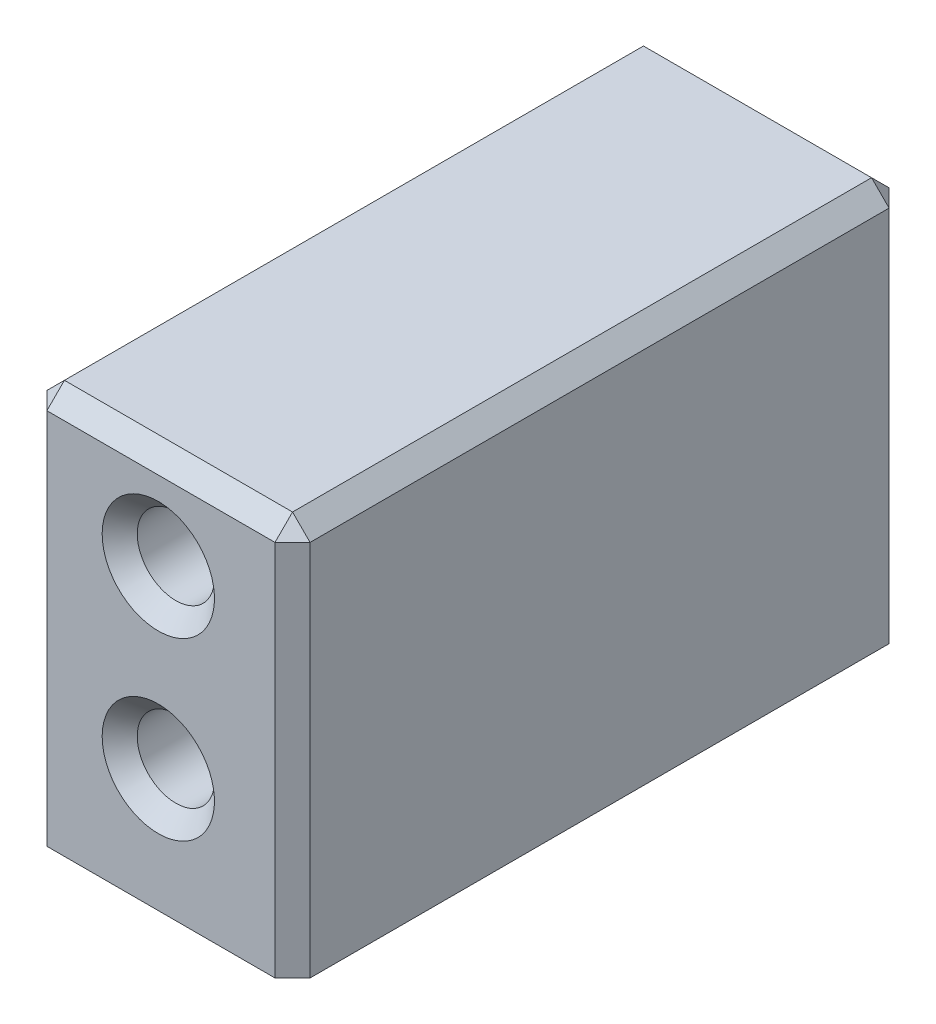
ISO-10303-21;
HEADER;
FILE_DESCRIPTION(('STEP AP214'),'2;1');
FILE_NAME('part.step','',(''),(''),'','','');
FILE_SCHEMA(('AUTOMOTIVE_DESIGN { 1 0 10303 214 1 1 1 1 }'));
ENDSEC;
DATA;
#1=APPLICATION_CONTEXT('core data for automotive mechanical design processes');
#2=APPLICATION_PROTOCOL_DEFINITION('international standard','automotive_design',2000,#1);
#3=PRODUCT_CONTEXT('',#1,'mechanical');
#4=PRODUCT('Part','Part','',(#3));
#5=PRODUCT_RELATED_PRODUCT_CATEGORY('part','',(#4));
#6=PRODUCT_DEFINITION_FORMATION('','',#4);
#7=PRODUCT_DEFINITION_CONTEXT('part definition',#1,'design');
#8=PRODUCT_DEFINITION('design','',#6,#7);
#9=PRODUCT_DEFINITION_SHAPE('','',#8);
#10=(LENGTH_UNIT() NAMED_UNIT(*) SI_UNIT(.MILLI.,.METRE.));
#11=(NAMED_UNIT(*) PLANE_ANGLE_UNIT() SI_UNIT($,.RADIAN.));
#12=(NAMED_UNIT(*) SI_UNIT($,.STERADIAN.) SOLID_ANGLE_UNIT());
#13=UNCERTAINTY_MEASURE_WITH_UNIT(LENGTH_MEASURE(1.E-05),#10,'distance_accuracy_value','');
#14=(GEOMETRIC_REPRESENTATION_CONTEXT(3) GLOBAL_UNCERTAINTY_ASSIGNED_CONTEXT((#13)) GLOBAL_UNIT_ASSIGNED_CONTEXT((#10,
#11,#12)) REPRESENTATION_CONTEXT('',''));
#15=CARTESIAN_POINT('',(0.,0.,0.));
#16=DIRECTION('',(0.,0.,1.));
#17=DIRECTION('',(1.,0.,0.));
#18=AXIS2_PLACEMENT_3D('',#15,#16,#17);
#19=CARTESIAN_POINT('',(-22.5245283018868,28.575,-21.306945754717));
#20=DIRECTION('',(0.,0.,1.));
#21=DIRECTION('',(1.,0.,0.));
#22=AXIS2_PLACEMENT_3D('',#19,#20,#21);
#23=PLANE('',#22);
#24=CARTESIAN_POINT('',(-32.2400283018868,8.89,-21.306945754717));
#25=DIRECTION('',(0.,0.,1.));
#26=DIRECTION('',(1.,0.,0.));
#27=AXIS2_PLACEMENT_3D('',#24,#25,#26);
#28=CIRCLE('',#27,4.06399999999999);
#29=CARTESIAN_POINT('',(-28.1760283018868,8.89,-21.306945754717));
#30=VERTEX_POINT('',#29);
#31=EDGE_CURVE('E276',#30,#30,#28,.T.);
#32=ORIENTED_EDGE('',*,*,#31,.T.);
#33=EDGE_LOOP('',(#32));
#34=FACE_BOUND('',#33,.T.);
#35=CARTESIAN_POINT('',(-32.2400283018868,21.59,-21.306945754717));
#36=DIRECTION('',(0.,0.,1.));
#37=DIRECTION('',(1.,0.,0.));
#38=AXIS2_PLACEMENT_3D('',#35,#36,#37);
#39=CIRCLE('',#38,4.06399999999999);
#40=CARTESIAN_POINT('',(-28.1760283018868,21.59,-21.306945754717));
#41=VERTEX_POINT('',#40);
#42=EDGE_CURVE('E272',#41,#41,#39,.T.);
#43=ORIENTED_EDGE('',*,*,#42,.T.);
#44=EDGE_LOOP('',(#43));
#45=FACE_BOUND('',#44,.T.);
#46=DIRECTION('',(-1.,0.,0.));
#47=VECTOR('',#46,1.);
#48=CARTESIAN_POINT('',(-22.5245283018868,0.,-21.306945754717));
#49=LINE('',#48,#47);
#50=CARTESIAN_POINT('',(-23.7945283018868,0.,-21.306945754717));
#51=VERTEX_POINT('',#50);
#52=CARTESIAN_POINT('',(-40.3045283018868,0.,-21.306945754717));
#53=VERTEX_POINT('',#52);
#54=EDGE_CURVE('E228',#51,#53,#49,.T.);
#55=ORIENTED_EDGE('',*,*,#54,.T.);
#56=DIRECTION('',(0.,1.,0.));
#57=VECTOR('',#56,1.);
#58=CARTESIAN_POINT('',(-40.3045283018868,28.575,-21.306945754717));
#59=LINE('',#58,#57);
#60=CARTESIAN_POINT('',(-40.3045283018868,27.305,-21.306945754717));
#61=VERTEX_POINT('',#60);
#62=EDGE_CURVE('E269',#53,#61,#59,.T.);
#63=ORIENTED_EDGE('',*,*,#62,.T.);
#64=DIRECTION('',(1.,0.,0.));
#65=VECTOR('',#64,1.);
#66=CARTESIAN_POINT('',(-22.5245283018868,27.305,-21.306945754717));
#67=LINE('',#66,#65);
#68=CARTESIAN_POINT('',(-23.7945283018868,27.305,-21.306945754717));
#69=VERTEX_POINT('',#68);
#70=EDGE_CURVE('E266',#61,#69,#67,.T.);
#71=ORIENTED_EDGE('',*,*,#70,.T.);
#72=DIRECTION('',(0.,-1.,0.));
#73=VECTOR('',#72,1.);
#74=CARTESIAN_POINT('',(-23.7945283018868,28.575,-21.306945754717));
#75=LINE('',#74,#73);
#76=EDGE_CURVE('E263',#69,#51,#75,.T.);
#77=ORIENTED_EDGE('',*,*,#76,.T.);
#78=EDGE_LOOP('',(#55,#63,#71,#77));
#79=FACE_BOUND('',#78,.T.);
#80=ADVANCED_FACE('F41',(#34,#45,#79),#23,.F.);
#81=CARTESIAN_POINT('',(-41.5745283018868,28.575,-21.306945754717));
#82=DIRECTION('',(1.,0.,0.));
#83=DIRECTION('',(0.,0.,-1.));
#84=AXIS2_PLACEMENT_3D('',#81,#82,#83);
#85=PLANE('',#84);
#86=DIRECTION('',(0.,0.,-1.));
#87=VECTOR('',#86,1.);
#88=CARTESIAN_POINT('',(-41.5745283018868,27.305,-21.306945754717));
#89=LINE('',#88,#87);
#90=CARTESIAN_POINT('',(-41.5745283018868,27.305,21.873054245283));
#91=VERTEX_POINT('',#90);
#92=CARTESIAN_POINT('',(-41.5745283018868,27.305,-20.036945754717));
#93=VERTEX_POINT('',#92);
#94=EDGE_CURVE('E155',#91,#93,#89,.T.);
#95=ORIENTED_EDGE('',*,*,#94,.T.);
#96=DIRECTION('',(0.,-1.,0.));
#97=VECTOR('',#96,1.);
#98=CARTESIAN_POINT('',(-41.5745283018868,28.575,-20.036945754717));
#99=LINE('',#98,#97);
#100=CARTESIAN_POINT('',(-41.5745283018868,0.,-20.036945754717));
#101=VERTEX_POINT('',#100);
#102=EDGE_CURVE('E148',#93,#101,#99,.T.);
#103=ORIENTED_EDGE('',*,*,#102,.T.);
#104=DIRECTION('',(0.,0.,1.));
#105=VECTOR('',#104,1.);
#106=CARTESIAN_POINT('',(-41.5745283018868,0.,-21.306945754717));
#107=LINE('',#106,#105);
#108=CARTESIAN_POINT('',(-41.5745283018868,0.,21.873054245283));
#109=VERTEX_POINT('',#108);
#110=EDGE_CURVE('E142',#101,#109,#107,.T.);
#111=ORIENTED_EDGE('',*,*,#110,.T.);
#112=DIRECTION('',(0.,1.,0.));
#113=VECTOR('',#112,1.);
#114=CARTESIAN_POINT('',(-41.5745283018868,28.575,21.873054245283));
#115=LINE('',#114,#113);
#116=EDGE_CURVE('E146',#109,#91,#115,.T.);
#117=ORIENTED_EDGE('',*,*,#116,.T.);
#118=EDGE_LOOP('',(#95,#103,#111,#117));
#119=FACE_BOUND('',#118,.T.);
#120=ADVANCED_FACE('F293',(#119),#85,.F.);
#121=CARTESIAN_POINT('',(-41.5745283018868,28.575,23.143054245283));
#122=DIRECTION('',(0.,0.,-1.));
#123=DIRECTION('',(-1.,0.,0.));
#124=AXIS2_PLACEMENT_3D('',#121,#122,#123);
#125=PLANE('',#124);
#126=CARTESIAN_POINT('',(-32.2400283018868,8.89,23.143054245283));
#127=DIRECTION('',(0.,0.,-1.));
#128=DIRECTION('',(-1.,0.,0.));
#129=AXIS2_PLACEMENT_3D('',#126,#127,#128);
#130=CIRCLE('',#129,4.06399999999999);
#131=CARTESIAN_POINT('',(-36.3040283018868,8.89,23.143054245283));
#132=VERTEX_POINT('',#131);
#133=EDGE_CURVE('E259',#132,#132,#130,.T.);
#134=ORIENTED_EDGE('',*,*,#133,.T.);
#135=EDGE_LOOP('',(#134));
#136=FACE_BOUND('',#135,.T.);
#137=CARTESIAN_POINT('',(-32.2400283018868,21.59,23.143054245283));
#138=DIRECTION('',(0.,0.,-1.));
#139=DIRECTION('',(-1.,0.,0.));
#140=AXIS2_PLACEMENT_3D('',#137,#138,#139);
#141=CIRCLE('',#140,4.06399999999999);
#142=CARTESIAN_POINT('',(-36.3040283018868,21.59,23.143054245283));
#143=VERTEX_POINT('',#142);
#144=EDGE_CURVE('E255',#143,#143,#141,.T.);
#145=ORIENTED_EDGE('',*,*,#144,.T.);
#146=EDGE_LOOP('',(#145));
#147=FACE_BOUND('',#146,.T.);
#148=DIRECTION('',(1.,0.,0.));
#149=VECTOR('',#148,1.);
#150=CARTESIAN_POINT('',(-41.5745283018868,0.,23.143054245283));
#151=LINE('',#150,#149);
#152=CARTESIAN_POINT('',(-40.3045283018868,0.,23.143054245283));
#153=VERTEX_POINT('',#152);
#154=CARTESIAN_POINT('',(-23.7945283018868,0.,23.143054245283));
#155=VERTEX_POINT('',#154);
#156=EDGE_CURVE('E121',#153,#155,#151,.T.);
#157=ORIENTED_EDGE('',*,*,#156,.T.);
#158=DIRECTION('',(0.,1.,0.));
#159=VECTOR('',#158,1.);
#160=CARTESIAN_POINT('',(-23.7945283018868,28.575,23.143054245283));
#161=LINE('',#160,#159);
#162=CARTESIAN_POINT('',(-23.7945283018868,27.305,23.143054245283));
#163=VERTEX_POINT('',#162);
#164=EDGE_CURVE('E252',#155,#163,#161,.T.);
#165=ORIENTED_EDGE('',*,*,#164,.T.);
#166=DIRECTION('',(-1.,0.,0.));
#167=VECTOR('',#166,1.);
#168=CARTESIAN_POINT('',(-41.5745283018868,27.305,23.143054245283));
#169=LINE('',#168,#167);
#170=CARTESIAN_POINT('',(-40.3045283018868,27.305,23.143054245283));
#171=VERTEX_POINT('',#170);
#172=EDGE_CURVE('E124',#163,#171,#169,.T.);
#173=ORIENTED_EDGE('',*,*,#172,.T.);
#174=DIRECTION('',(0.,-1.,0.));
#175=VECTOR('',#174,1.);
#176=CARTESIAN_POINT('',(-40.3045283018868,28.575,23.143054245283));
#177=LINE('',#176,#175);
#178=EDGE_CURVE('E118',#171,#153,#177,.T.);
#179=ORIENTED_EDGE('',*,*,#178,.T.);
#180=EDGE_LOOP('',(#157,#165,#173,#179));
#181=FACE_BOUND('',#180,.T.);
#182=ADVANCED_FACE('F120',(#136,#147,#181),#125,.F.);
#183=CARTESIAN_POINT('',(-22.5245283018868,28.575,23.143054245283));
#184=DIRECTION('',(-1.,0.,0.));
#185=DIRECTION('',(0.,0.,1.));
#186=AXIS2_PLACEMENT_3D('',#183,#184,#185);
#187=PLANE('',#186);
#188=DIRECTION('',(0.,0.,-1.));
#189=VECTOR('',#188,1.);
#190=CARTESIAN_POINT('',(-22.5245283018868,0.,23.143054245283));
#191=LINE('',#190,#189);
#192=CARTESIAN_POINT('',(-22.5245283018868,0.,21.873054245283));
#193=VERTEX_POINT('',#192);
#194=CARTESIAN_POINT('',(-22.5245283018868,0.,-20.036945754717));
#195=VERTEX_POINT('',#194);
#196=EDGE_CURVE('E141',#193,#195,#191,.T.);
#197=ORIENTED_EDGE('',*,*,#196,.T.);
#198=DIRECTION('',(0.,1.,0.));
#199=VECTOR('',#198,1.);
#200=CARTESIAN_POINT('',(-22.5245283018868,28.575,-20.036945754717));
#201=LINE('',#200,#199);
#202=CARTESIAN_POINT('',(-22.5245283018868,27.305,-20.036945754717));
#203=VERTEX_POINT('',#202);
#204=EDGE_CURVE('E11',#195,#203,#201,.T.);
#205=ORIENTED_EDGE('',*,*,#204,.T.);
#206=DIRECTION('',(0.,0.,1.));
#207=VECTOR('',#206,1.);
#208=CARTESIAN_POINT('',(-22.5245283018868,27.305,23.143054245283));
#209=LINE('',#208,#207);
#210=CARTESIAN_POINT('',(-22.5245283018868,27.305,21.873054245283));
#211=VERTEX_POINT('',#210);
#212=EDGE_CURVE('E52',#203,#211,#209,.T.);
#213=ORIENTED_EDGE('',*,*,#212,.T.);
#214=DIRECTION('',(0.,-1.,0.));
#215=VECTOR('',#214,1.);
#216=CARTESIAN_POINT('',(-22.5245283018868,28.575,21.873054245283));
#217=LINE('',#216,#215);
#218=EDGE_CURVE('E177',#211,#193,#217,.T.);
#219=ORIENTED_EDGE('',*,*,#218,.T.);
#220=EDGE_LOOP('',(#197,#205,#213,#219));
#221=FACE_BOUND('',#220,.T.);
#222=ADVANCED_FACE('F542',(#221),#187,.F.);
#223=CARTESIAN_POINT('',(0.,28.575,0.));
#224=DIRECTION('',(0.,1.,0.));
#225=DIRECTION('',(0.,0.,1.));
#226=AXIS2_PLACEMENT_3D('',#223,#224,#225);
#227=PLANE('',#226);
#228=DIRECTION('',(0.,0.,-1.));
#229=VECTOR('',#228,1.);
#230=CARTESIAN_POINT('',(-23.7945283018868,28.575,-21.306945754717));
#231=LINE('',#230,#229);
#232=CARTESIAN_POINT('',(-23.7945283018868,28.575,21.873054245283));
#233=VERTEX_POINT('',#232);
#234=CARTESIAN_POINT('',(-23.7945283018868,28.575,-20.036945754717));
#235=VERTEX_POINT('',#234);
#236=EDGE_CURVE('E167',#233,#235,#231,.T.);
#237=ORIENTED_EDGE('',*,*,#236,.T.);
#238=DIRECTION('',(-1.,0.,0.));
#239=VECTOR('',#238,1.);
#240=CARTESIAN_POINT('',(-41.5745283018868,28.575,-20.036945754717));
#241=LINE('',#240,#239);
#242=CARTESIAN_POINT('',(-40.3045283018868,28.575,-20.036945754717));
#243=VERTEX_POINT('',#242);
#244=EDGE_CURVE('E173',#235,#243,#241,.T.);
#245=ORIENTED_EDGE('',*,*,#244,.T.);
#246=DIRECTION('',(0.,0.,1.));
#247=VECTOR('',#246,1.);
#248=CARTESIAN_POINT('',(-40.3045283018868,28.575,23.143054245283));
#249=LINE('',#248,#247);
#250=CARTESIAN_POINT('',(-40.3045283018868,28.575,21.873054245283));
#251=VERTEX_POINT('',#250);
#252=EDGE_CURVE('E170',#243,#251,#249,.T.);
#253=ORIENTED_EDGE('',*,*,#252,.T.);
#254=DIRECTION('',(1.,0.,0.));
#255=VECTOR('',#254,1.);
#256=CARTESIAN_POINT('',(-22.5245283018868,28.575,21.873054245283));
#257=LINE('',#256,#255);
#258=EDGE_CURVE('E164',#251,#233,#257,.T.);
#259=ORIENTED_EDGE('',*,*,#258,.T.);
#260=EDGE_LOOP('',(#237,#245,#253,#259));
#261=FACE_BOUND('',#260,.T.);
#262=ADVANCED_FACE('F316',(#261),#227,.T.);
#263=CARTESIAN_POINT('',(0.,0.,0.));
#264=DIRECTION('',(0.,1.,0.));
#265=DIRECTION('',(0.,0.,1.));
#266=AXIS2_PLACEMENT_3D('',#263,#264,#265);
#267=PLANE('',#266);
#268=ORIENTED_EDGE('',*,*,#110,.F.);
#269=DIRECTION('',(-0.707106781186544,0.,0.707106781186551));
#270=VECTOR('',#269,1.);
#271=CARTESIAN_POINT('',(-41.5745283018868,0.,-20.036945754717));
#272=LINE('',#271,#270);
#273=EDGE_CURVE('E161',#101,#53,#272,.F.);
#274=ORIENTED_EDGE('',*,*,#273,.T.);
#275=ORIENTED_EDGE('',*,*,#54,.F.);
#276=DIRECTION('',(-0.707106781186544,0.,-0.707106781186551));
#277=VECTOR('',#276,1.);
#278=CARTESIAN_POINT('',(-23.7945283018868,0.,-21.306945754717));
#279=LINE('',#278,#277);
#280=EDGE_CURVE('E152',#51,#195,#279,.F.);
#281=ORIENTED_EDGE('',*,*,#280,.T.);
#282=ORIENTED_EDGE('',*,*,#196,.F.);
#283=DIRECTION('',(0.707106781186544,0.,-0.707106781186551));
#284=VECTOR('',#283,1.);
#285=CARTESIAN_POINT('',(-22.5245283018868,0.,21.873054245283));
#286=LINE('',#285,#284);
#287=EDGE_CURVE('E139',#193,#155,#286,.F.);
#288=ORIENTED_EDGE('',*,*,#287,.T.);
#289=ORIENTED_EDGE('',*,*,#156,.F.);
#290=DIRECTION('',(0.707106781186544,0.,0.707106781186551));
#291=VECTOR('',#290,1.);
#292=CARTESIAN_POINT('',(-40.3045283018868,0.,23.143054245283));
#293=LINE('',#292,#291);
#294=EDGE_CURVE('E135',#153,#109,#293,.F.);
#295=ORIENTED_EDGE('',*,*,#294,.T.);
#296=EDGE_LOOP('',(#268,#274,#275,#281,#282,#288,#289,#295));
#297=FACE_BOUND('',#296,.T.);
#298=ADVANCED_FACE('F134',(#297),#267,.F.);
#299=CARTESIAN_POINT('',(-32.2400283018868,8.89,-21.306945754717));
#300=DIRECTION('',(0.,0.,1.));
#301=DIRECTION('',(1.,0.,0.));
#302=AXIS2_PLACEMENT_3D('',#299,#300,#301);
#303=CYLINDRICAL_SURFACE('',#302,2.794);
#304=CARTESIAN_POINT('',(-32.2400283018868,8.89,21.873054245283));
#305=DIRECTION('',(0.,0.,-1.));
#306=DIRECTION('',(-1.,0.,0.));
#307=AXIS2_PLACEMENT_3D('',#304,#305,#306);
#308=CIRCLE('',#307,2.794);
#309=CARTESIAN_POINT('',(-35.0340283018868,8.89,21.873054245283));
#310=VERTEX_POINT('',#309);
#311=EDGE_CURVE('E130',#310,#310,#308,.F.);
#312=ORIENTED_EDGE('',*,*,#311,.T.);
#313=EDGE_LOOP('',(#312));
#314=FACE_BOUND('',#313,.T.);
#315=CARTESIAN_POINT('',(-32.2400283018868,8.89,-20.036945754717));
#316=DIRECTION('',(0.,0.,1.));
#317=DIRECTION('',(1.,0.,0.));
#318=AXIS2_PLACEMENT_3D('',#315,#316,#317);
#319=CIRCLE('',#318,2.794);
#320=CARTESIAN_POINT('',(-29.4460283018868,8.89,-20.036945754717));
#321=VERTEX_POINT('',#320);
#322=EDGE_CURVE('E243',#321,#321,#319,.F.);
#323=ORIENTED_EDGE('',*,*,#322,.T.);
#324=EDGE_LOOP('',(#323));
#325=FACE_BOUND('',#324,.T.);
#326=ADVANCED_FACE('F518',(#314,#325),#303,.F.);
#327=CARTESIAN_POINT('',(-32.2400283018868,21.59,-21.306945754717));
#328=DIRECTION('',(0.,0.,1.));
#329=DIRECTION('',(1.,0.,0.));
#330=AXIS2_PLACEMENT_3D('',#327,#328,#329);
#331=CYLINDRICAL_SURFACE('',#330,2.794);
#332=CARTESIAN_POINT('',(-32.2400283018868,21.59,21.873054245283));
#333=DIRECTION('',(0.,0.,-1.));
#334=DIRECTION('',(-1.,0.,0.));
#335=AXIS2_PLACEMENT_3D('',#332,#333,#334);
#336=CIRCLE('',#335,2.794);
#337=CARTESIAN_POINT('',(-35.0340283018868,21.59,21.873054245283));
#338=VERTEX_POINT('',#337);
#339=EDGE_CURVE('E284',#338,#338,#336,.F.);
#340=ORIENTED_EDGE('',*,*,#339,.T.);
#341=EDGE_LOOP('',(#340));
#342=FACE_BOUND('',#341,.T.);
#343=CARTESIAN_POINT('',(-32.2400283018868,21.59,-20.036945754717));
#344=DIRECTION('',(0.,0.,1.));
#345=DIRECTION('',(1.,0.,0.));
#346=AXIS2_PLACEMENT_3D('',#343,#344,#345);
#347=CIRCLE('',#346,2.794);
#348=CARTESIAN_POINT('',(-29.4460283018868,21.59,-20.036945754717));
#349=VERTEX_POINT('',#348);
#350=EDGE_CURVE('E280',#349,#349,#347,.F.);
#351=ORIENTED_EDGE('',*,*,#350,.T.);
#352=EDGE_LOOP('',(#351));
#353=FACE_BOUND('',#352,.T.);
#354=ADVANCED_FACE('F348',(#342,#353),#331,.F.);
#355=CARTESIAN_POINT('',(-32.2400283018868,8.89,21.873054245283));
#356=DIRECTION('',(0.,0.,1.));
#357=DIRECTION('',(1.,0.,0.));
#358=AXIS2_PLACEMENT_3D('',#355,#356,#357);
#359=CONICAL_SURFACE('',#358,2.794,0.78539816339745);
#360=ORIENTED_EDGE('',*,*,#133,.F.);
#361=EDGE_LOOP('',(#360));
#362=FACE_BOUND('',#361,.T.);
#363=ORIENTED_EDGE('',*,*,#311,.F.);
#364=EDGE_LOOP('',(#363));
#365=FACE_BOUND('',#364,.T.);
#366=ADVANCED_FACE('F341',(#362,#365),#359,.F.);
#367=CARTESIAN_POINT('',(-32.2400283018868,8.89,-21.306945754717));
#368=DIRECTION('',(0.,0.,-1.));
#369=DIRECTION('',(-1.,0.,0.));
#370=AXIS2_PLACEMENT_3D('',#367,#368,#369);
#371=CONICAL_SURFACE('',#370,4.06399999999999,0.785398163397443);
#372=ORIENTED_EDGE('',*,*,#322,.F.);
#373=EDGE_LOOP('',(#372));
#374=FACE_BOUND('',#373,.T.);
#375=ORIENTED_EDGE('',*,*,#31,.F.);
#376=EDGE_LOOP('',(#375));
#377=FACE_BOUND('',#376,.T.);
#378=ADVANCED_FACE('F347',(#374,#377),#371,.F.);
#379=CARTESIAN_POINT('',(-32.2400283018868,21.59,21.873054245283));
#380=DIRECTION('',(0.,0.,1.));
#381=DIRECTION('',(1.,0.,0.));
#382=AXIS2_PLACEMENT_3D('',#379,#380,#381);
#383=CONICAL_SURFACE('',#382,2.794,0.78539816339745);
#384=ORIENTED_EDGE('',*,*,#144,.F.);
#385=EDGE_LOOP('',(#384));
#386=FACE_BOUND('',#385,.T.);
#387=ORIENTED_EDGE('',*,*,#339,.F.);
#388=EDGE_LOOP('',(#387));
#389=FACE_BOUND('',#388,.T.);
#390=ADVANCED_FACE('F355',(#386,#389),#383,.F.);
#391=CARTESIAN_POINT('',(-32.2400283018868,21.59,-21.306945754717));
#392=DIRECTION('',(0.,0.,-1.));
#393=DIRECTION('',(-1.,0.,0.));
#394=AXIS2_PLACEMENT_3D('',#391,#392,#393);
#395=CONICAL_SURFACE('',#394,4.06399999999999,0.785398163397443);
#396=ORIENTED_EDGE('',*,*,#350,.F.);
#397=EDGE_LOOP('',(#396));
#398=FACE_BOUND('',#397,.T.);
#399=ORIENTED_EDGE('',*,*,#42,.F.);
#400=EDGE_LOOP('',(#399));
#401=FACE_BOUND('',#400,.T.);
#402=ADVANCED_FACE('F327',(#398,#401),#395,.F.);
#403=CARTESIAN_POINT('',(-22.5245283018868,28.575,21.873054245283));
#404=DIRECTION('',(-0.707106781186551,0.,-0.707106781186544));
#405=DIRECTION('',(0.,-1.,0.));
#406=AXIS2_PLACEMENT_3D('',#403,#404,#405);
#407=PLANE('',#406);
#408=DIRECTION('',(-0.707106781186544,0.,0.707106781186551));
#409=VECTOR('',#408,1.);
#410=CARTESIAN_POINT('',(-22.5245283018868,27.305,21.873054245283));
#411=LINE('',#410,#409);
#412=EDGE_CURVE('E46',#163,#211,#411,.F.);
#413=ORIENTED_EDGE('',*,*,#412,.F.);
#414=ORIENTED_EDGE('',*,*,#164,.F.);
#415=ORIENTED_EDGE('',*,*,#287,.F.);
#416=ORIENTED_EDGE('',*,*,#218,.F.);
#417=EDGE_LOOP('',(#413,#414,#415,#416));
#418=FACE_BOUND('',#417,.T.);
#419=ADVANCED_FACE('F44',(#418),#407,.F.);
#420=CARTESIAN_POINT('',(-22.5245283018868,27.305,21.873054245283));
#421=DIRECTION('',(0.577350269189632,0.577350269189626,0.577350269189619));
#422=DIRECTION('',(-0.707106781186544,0.707106781186551,0.));
#423=AXIS2_PLACEMENT_3D('',#420,#421,#422);
#424=PLANE('',#423);
#425=DIRECTION('',(0.,-0.707106781186544,0.707106781186551));
#426=VECTOR('',#425,1.);
#427=CARTESIAN_POINT('',(-23.7945283018868,27.94,22.508054245283));
#428=LINE('',#427,#426);
#429=EDGE_CURVE('E217',#163,#233,#428,.F.);
#430=ORIENTED_EDGE('',*,*,#429,.F.);
#431=ORIENTED_EDGE('',*,*,#412,.T.);
#432=DIRECTION('',(-0.707106781186544,0.707106781186551,0.));
#433=VECTOR('',#432,1.);
#434=CARTESIAN_POINT('',(-22.5245283018868,27.305,21.873054245283));
#435=LINE('',#434,#433);
#436=EDGE_CURVE('E220',#233,#211,#435,.F.);
#437=ORIENTED_EDGE('',*,*,#436,.F.);
#438=EDGE_LOOP('',(#430,#431,#437));
#439=FACE_BOUND('',#438,.T.);
#440=ADVANCED_FACE('F320',(#439),#424,.T.);
#441=CARTESIAN_POINT('',(-23.7945283018868,28.575,-21.306945754717));
#442=DIRECTION('',(-0.707106781186551,0.,0.707106781186544));
#443=DIRECTION('',(0.,-1.,0.));
#444=AXIS2_PLACEMENT_3D('',#441,#442,#443);
#445=PLANE('',#444);
#446=ORIENTED_EDGE('',*,*,#280,.F.);
#447=ORIENTED_EDGE('',*,*,#76,.F.);
#448=DIRECTION('',(0.707106781186544,0.,0.707106781186551));
#449=VECTOR('',#448,1.);
#450=CARTESIAN_POINT('',(-23.7945283018868,27.305,-21.306945754717));
#451=LINE('',#450,#449);
#452=EDGE_CURVE('E213',#203,#69,#451,.F.);
#453=ORIENTED_EDGE('',*,*,#452,.F.);
#454=ORIENTED_EDGE('',*,*,#204,.F.);
#455=EDGE_LOOP('',(#446,#447,#453,#454));
#456=FACE_BOUND('',#455,.T.);
#457=ADVANCED_FACE('F307',(#456),#445,.F.);
#458=CARTESIAN_POINT('',(-23.7945283018868,28.575,0.));
#459=DIRECTION('',(0.707106781186551,0.707106781186544,0.));
#460=DIRECTION('',(0.,0.,1.));
#461=AXIS2_PLACEMENT_3D('',#458,#459,#460);
#462=PLANE('',#461);
#463=ORIENTED_EDGE('',*,*,#436,.T.);
#464=ORIENTED_EDGE('',*,*,#212,.F.);
#465=DIRECTION('',(0.707106781186544,-0.707106781186552,0.));
#466=VECTOR('',#465,1.);
#467=CARTESIAN_POINT('',(-23.1595283018868,27.94,-20.036945754717));
#468=LINE('',#467,#466);
#469=EDGE_CURVE('E209',#235,#203,#468,.T.);
#470=ORIENTED_EDGE('',*,*,#469,.F.);
#471=ORIENTED_EDGE('',*,*,#236,.F.);
#472=EDGE_LOOP('',(#463,#464,#470,#471));
#473=FACE_BOUND('',#472,.T.);
#474=ADVANCED_FACE('F314',(#473),#462,.T.);
#475=CARTESIAN_POINT('',(0.,28.575,21.873054245283));
#476=DIRECTION('',(0.,0.707106781186551,0.707106781186544));
#477=DIRECTION('',(-1.,0.,0.));
#478=AXIS2_PLACEMENT_3D('',#475,#476,#477);
#479=PLANE('',#478);
#480=ORIENTED_EDGE('',*,*,#429,.T.);
#481=ORIENTED_EDGE('',*,*,#258,.F.);
#482=DIRECTION('',(0.,0.707106781186544,-0.707106781186551));
#483=VECTOR('',#482,1.);
#484=CARTESIAN_POINT('',(-40.3045283018868,28.575,21.873054245283));
#485=LINE('',#484,#483);
#486=EDGE_CURVE('E205',#171,#251,#485,.T.);
#487=ORIENTED_EDGE('',*,*,#486,.F.);
#488=ORIENTED_EDGE('',*,*,#172,.F.);
#489=EDGE_LOOP('',(#480,#481,#487,#488));
#490=FACE_BOUND('',#489,.T.);
#491=ADVANCED_FACE('F319',(#490),#479,.T.);
#492=CARTESIAN_POINT('',(-40.3045283018868,28.575,23.143054245283));
#493=DIRECTION('',(0.707106781186551,0.,-0.707106781186544));
#494=DIRECTION('',(0.,-1.,0.));
#495=AXIS2_PLACEMENT_3D('',#492,#493,#494);
#496=PLANE('',#495);
#497=ORIENTED_EDGE('',*,*,#294,.F.);
#498=ORIENTED_EDGE('',*,*,#178,.F.);
#499=DIRECTION('',(-0.707106781186544,0.,-0.707106781186551));
#500=VECTOR('',#499,1.);
#501=CARTESIAN_POINT('',(-40.9395283018868,27.305,22.508054245283));
#502=LINE('',#501,#500);
#503=EDGE_CURVE('E201',#91,#171,#502,.F.);
#504=ORIENTED_EDGE('',*,*,#503,.F.);
#505=ORIENTED_EDGE('',*,*,#116,.F.);
#506=EDGE_LOOP('',(#497,#498,#504,#505));
#507=FACE_BOUND('',#506,.T.);
#508=ADVANCED_FACE('F145',(#507),#496,.F.);
#509=CARTESIAN_POINT('',(-23.7945283018868,27.305,-21.306945754717));
#510=DIRECTION('',(0.577350269189632,0.577350269189619,-0.577350269189626));
#511=DIRECTION('',(-0.707106781186544,0.,-0.707106781186551));
#512=AXIS2_PLACEMENT_3D('',#509,#510,#511);
#513=PLANE('',#512);
#514=ORIENTED_EDGE('',*,*,#469,.T.);
#515=ORIENTED_EDGE('',*,*,#452,.T.);
#516=DIRECTION('',(0.,0.707106781186551,0.707106781186544));
#517=VECTOR('',#516,1.);
#518=CARTESIAN_POINT('',(-23.7945283018868,27.305,-21.306945754717));
#519=LINE('',#518,#517);
#520=EDGE_CURVE('E197',#235,#69,#519,.F.);
#521=ORIENTED_EDGE('',*,*,#520,.F.);
#522=EDGE_LOOP('',(#514,#515,#521));
#523=FACE_BOUND('',#522,.T.);
#524=ADVANCED_FACE('F312',(#523),#513,.T.);
#525=CARTESIAN_POINT('',(-40.3045283018868,28.575,21.873054245283));
#526=DIRECTION('',(-0.577350269189632,0.577350269189626,0.577350269189619));
#527=DIRECTION('',(-0.707106781186544,-0.707106781186551,0.));
#528=AXIS2_PLACEMENT_3D('',#525,#526,#527);
#529=PLANE('',#528);
#530=ORIENTED_EDGE('',*,*,#503,.T.);
#531=ORIENTED_EDGE('',*,*,#486,.T.);
#532=DIRECTION('',(-0.707106781186544,-0.707106781186551,0.));
#533=VECTOR('',#532,1.);
#534=CARTESIAN_POINT('',(-40.3045283018868,28.575,21.873054245283));
#535=LINE('',#534,#533);
#536=EDGE_CURVE('E193',#91,#251,#535,.F.);
#537=ORIENTED_EDGE('',*,*,#536,.F.);
#538=EDGE_LOOP('',(#530,#531,#537));
#539=FACE_BOUND('',#538,.T.);
#540=ADVANCED_FACE('F390',(#539),#529,.T.);
#541=CARTESIAN_POINT('',(0.,28.575,-20.036945754717));
#542=DIRECTION('',(0.,0.707106781186544,-0.707106781186551));
#543=DIRECTION('',(1.,0.,0.));
#544=AXIS2_PLACEMENT_3D('',#541,#542,#543);
#545=PLANE('',#544);
#546=ORIENTED_EDGE('',*,*,#520,.T.);
#547=ORIENTED_EDGE('',*,*,#70,.F.);
#548=DIRECTION('',(0.,-0.707106781186551,-0.707106781186544));
#549=VECTOR('',#548,1.);
#550=CARTESIAN_POINT('',(-40.3045283018868,27.305,-21.306945754717));
#551=LINE('',#550,#549);
#552=EDGE_CURVE('E189',#243,#61,#551,.T.);
#553=ORIENTED_EDGE('',*,*,#552,.F.);
#554=ORIENTED_EDGE('',*,*,#244,.F.);
#555=EDGE_LOOP('',(#546,#547,#553,#554));
#556=FACE_BOUND('',#555,.T.);
#557=ADVANCED_FACE('F384',(#556),#545,.T.);
#558=CARTESIAN_POINT('',(-40.3045283018868,28.575,0.));
#559=DIRECTION('',(-0.707106781186551,0.707106781186544,0.));
#560=DIRECTION('',(0.,0.,-1.));
#561=AXIS2_PLACEMENT_3D('',#558,#559,#560);
#562=PLANE('',#561);
#563=ORIENTED_EDGE('',*,*,#536,.T.);
#564=ORIENTED_EDGE('',*,*,#252,.F.);
#565=DIRECTION('',(0.707106781186544,0.707106781186552,0.));
#566=VECTOR('',#565,1.);
#567=CARTESIAN_POINT('',(-40.9395283018868,27.94,-20.036945754717));
#568=LINE('',#567,#566);
#569=EDGE_CURVE('E186',#93,#243,#568,.T.);
#570=ORIENTED_EDGE('',*,*,#569,.F.);
#571=ORIENTED_EDGE('',*,*,#94,.F.);
#572=EDGE_LOOP('',(#563,#564,#570,#571));
#573=FACE_BOUND('',#572,.T.);
#574=ADVANCED_FACE('F298',(#573),#562,.T.);
#575=CARTESIAN_POINT('',(-40.3045283018868,27.305,-21.306945754717));
#576=DIRECTION('',(-0.577350269189632,0.577350269189619,-0.577350269189626));
#577=DIRECTION('',(-0.707106781186544,0.,0.707106781186551));
#578=AXIS2_PLACEMENT_3D('',#575,#576,#577);
#579=PLANE('',#578);
#580=ORIENTED_EDGE('',*,*,#569,.T.);
#581=ORIENTED_EDGE('',*,*,#552,.T.);
#582=DIRECTION('',(0.707106781186544,0.,-0.707106781186551));
#583=VECTOR('',#582,1.);
#584=CARTESIAN_POINT('',(-40.3045283018868,27.305,-21.306945754717));
#585=LINE('',#584,#583);
#586=EDGE_CURVE('E182',#93,#61,#585,.T.);
#587=ORIENTED_EDGE('',*,*,#586,.F.);
#588=EDGE_LOOP('',(#580,#581,#587));
#589=FACE_BOUND('',#588,.T.);
#590=ADVANCED_FACE('F301',(#589),#579,.T.);
#591=CARTESIAN_POINT('',(-41.5745283018868,28.575,-20.036945754717));
#592=DIRECTION('',(0.707106781186551,0.,0.707106781186544));
#593=DIRECTION('',(0.,-1.,0.));
#594=AXIS2_PLACEMENT_3D('',#591,#592,#593);
#595=PLANE('',#594);
#596=ORIENTED_EDGE('',*,*,#586,.T.);
#597=ORIENTED_EDGE('',*,*,#62,.F.);
#598=ORIENTED_EDGE('',*,*,#273,.F.);
#599=ORIENTED_EDGE('',*,*,#102,.F.);
#600=EDGE_LOOP('',(#596,#597,#598,#599));
#601=FACE_BOUND('',#600,.T.);
#602=ADVANCED_FACE('F303',(#601),#595,.F.);
#603=CLOSED_SHELL('',(#80,#120,#182,#222,#262,#298,#326,#354,#366,#378,#390,#402,#419,#440,#457,
#474,#491,#508,#524,#540,#557,#574,#590,#602));
#604=MANIFOLD_SOLID_BREP('B2',#603);
#605=ADVANCED_BREP_SHAPE_REPRESENTATION('',(#18,#604),#14);
#606=SHAPE_DEFINITION_REPRESENTATION(#9,#605);
ENDSEC;
END-ISO-10303-21;
